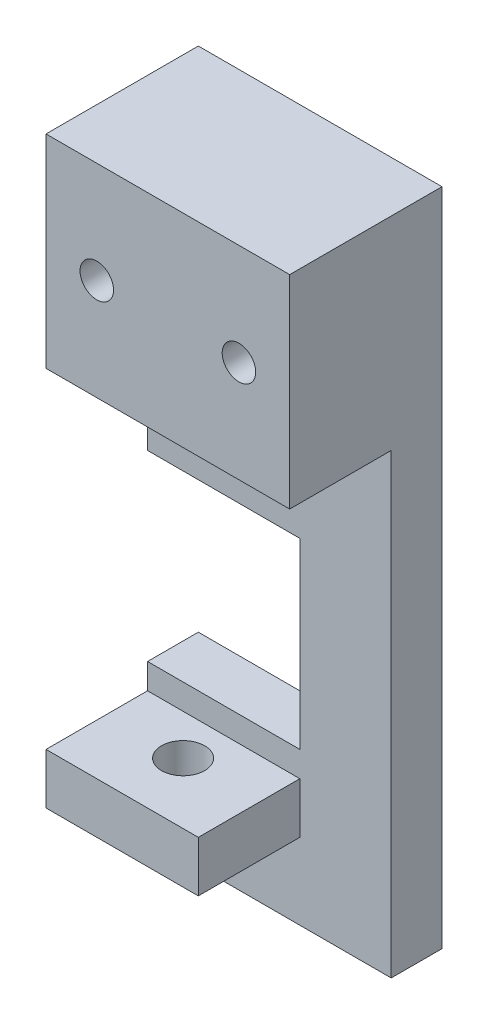
ISO-10303-21;
HEADER;
FILE_DESCRIPTION(('STEP AP214'),'2;1');
FILE_NAME('part.step','',(''),(''),'','','');
FILE_SCHEMA(('AUTOMOTIVE_DESIGN { 1 0 10303 214 1 1 1 1 }'));
ENDSEC;
DATA;
#1=APPLICATION_CONTEXT('core data for automotive mechanical design processes');
#2=APPLICATION_PROTOCOL_DEFINITION('international standard','automotive_design',2000,#1);
#3=PRODUCT_CONTEXT('',#1,'mechanical');
#4=PRODUCT('Part','Part','',(#3));
#5=PRODUCT_RELATED_PRODUCT_CATEGORY('part','',(#4));
#6=PRODUCT_DEFINITION_FORMATION('','',#4);
#7=PRODUCT_DEFINITION_CONTEXT('part definition',#1,'design');
#8=PRODUCT_DEFINITION('design','',#6,#7);
#9=PRODUCT_DEFINITION_SHAPE('','',#8);
#10=(LENGTH_UNIT() NAMED_UNIT(*) SI_UNIT(.MILLI.,.METRE.));
#11=(NAMED_UNIT(*) PLANE_ANGLE_UNIT() SI_UNIT($,.RADIAN.));
#12=(NAMED_UNIT(*) SI_UNIT($,.STERADIAN.) SOLID_ANGLE_UNIT());
#13=UNCERTAINTY_MEASURE_WITH_UNIT(LENGTH_MEASURE(1.E-05),#10,'distance_accuracy_value','');
#14=(GEOMETRIC_REPRESENTATION_CONTEXT(3) GLOBAL_UNCERTAINTY_ASSIGNED_CONTEXT((#13)) GLOBAL_UNIT_ASSIGNED_CONTEXT((#10,
#11,#12)) REPRESENTATION_CONTEXT('',''));
#15=CARTESIAN_POINT('',(0.,0.,0.));
#16=DIRECTION('',(0.,0.,1.));
#17=DIRECTION('',(1.,0.,0.));
#18=AXIS2_PLACEMENT_3D('',#15,#16,#17);
#19=CARTESIAN_POINT('',(15.,15.,18.0023));
#20=DIRECTION('',(0.,1.,0.));
#21=DIRECTION('',(0.,0.,1.));
#22=AXIS2_PLACEMENT_3D('',#19,#20,#21);
#23=CYLINDRICAL_SURFACE('',#22,4.25);
#24=CARTESIAN_POINT('',(15.,15.,18.0023));
#25=DIRECTION('',(0.,1.,0.));
#26=DIRECTION('',(0.,0.,1.));
#27=AXIS2_PLACEMENT_3D('',#24,#25,#26);
#28=CIRCLE('',#27,4.25);
#29=CARTESIAN_POINT('',(15.,15.,22.2523));
#30=VERTEX_POINT('',#29);
#31=EDGE_CURVE('E130',#30,#30,#28,.F.);
#32=ORIENTED_EDGE('',*,*,#31,.T.);
#33=EDGE_LOOP('',(#32));
#34=FACE_BOUND('',#33,.T.);
#35=CARTESIAN_POINT('',(15.,25.,18.0023));
#36=DIRECTION('',(0.,1.,0.));
#37=DIRECTION('',(0.,0.,1.));
#38=AXIS2_PLACEMENT_3D('',#35,#36,#37);
#39=CIRCLE('',#38,4.25);
#40=CARTESIAN_POINT('',(15.,25.,22.2523));
#41=VERTEX_POINT('',#40);
#42=EDGE_CURVE('E19',#41,#41,#39,.F.);
#43=ORIENTED_EDGE('',*,*,#42,.F.);
#44=EDGE_LOOP('',(#43));
#45=FACE_BOUND('',#44,.T.);
#46=ADVANCED_FACE('F16',(#34,#45),#23,.F.);
#47=CARTESIAN_POINT('',(30.,15.,30.0023));
#48=DIRECTION('',(0.,0.,1.));
#49=DIRECTION('',(1.,0.,0.));
#50=AXIS2_PLACEMENT_3D('',#47,#48,#49);
#51=PLANE('',#50);
#52=DIRECTION('',(1.,0.,0.));
#53=VECTOR('',#52,1.);
#54=CARTESIAN_POINT('',(30.,15.,30.0023));
#55=LINE('',#54,#53);
#56=CARTESIAN_POINT('',(0.,15.,30.0023));
#57=VERTEX_POINT('',#56);
#58=CARTESIAN_POINT('',(30.,15.,30.0023));
#59=VERTEX_POINT('',#58);
#60=EDGE_CURVE('E115',#57,#59,#55,.T.);
#61=ORIENTED_EDGE('',*,*,#60,.T.);
#62=DIRECTION('',(0.,1.,0.));
#63=VECTOR('',#62,1.);
#64=CARTESIAN_POINT('',(30.,15.,30.0023));
#65=LINE('',#64,#63);
#66=CARTESIAN_POINT('',(30.,25.,30.0023));
#67=VERTEX_POINT('',#66);
#68=EDGE_CURVE('E135',#59,#67,#65,.T.);
#69=ORIENTED_EDGE('',*,*,#68,.T.);
#70=DIRECTION('',(1.,0.,0.));
#71=VECTOR('',#70,1.);
#72=CARTESIAN_POINT('',(30.,25.,30.0023));
#73=LINE('',#72,#71);
#74=CARTESIAN_POINT('',(0.,25.,30.0023));
#75=VERTEX_POINT('',#74);
#76=EDGE_CURVE('E133',#75,#67,#73,.T.);
#77=ORIENTED_EDGE('',*,*,#76,.F.);
#78=DIRECTION('',(0.,1.,0.));
#79=VECTOR('',#78,1.);
#80=CARTESIAN_POINT('',(0.,15.,30.0023));
#81=LINE('',#80,#79);
#82=EDGE_CURVE('E120',#57,#75,#81,.T.);
#83=ORIENTED_EDGE('',*,*,#82,.F.);
#84=EDGE_LOOP('',(#61,#69,#77,#83));
#85=FACE_BOUND('',#84,.T.);
#86=ADVANCED_FACE('F134',(#85),#51,.T.);
#87=CARTESIAN_POINT('',(30.,25.,10.0023));
#88=DIRECTION('',(0.,1.,0.));
#89=DIRECTION('',(0.,0.,1.));
#90=AXIS2_PLACEMENT_3D('',#87,#88,#89);
#91=PLANE('',#90);
#92=ORIENTED_EDGE('',*,*,#42,.T.);
#93=EDGE_LOOP('',(#92));
#94=FACE_BOUND('',#93,.T.);
#95=DIRECTION('',(0.,0.,1.));
#96=VECTOR('',#95,1.);
#97=CARTESIAN_POINT('',(30.,25.,10.0023));
#98=LINE('',#97,#96);
#99=CARTESIAN_POINT('',(30.,25.,10.0023));
#100=VERTEX_POINT('',#99);
#101=EDGE_CURVE('E192',#67,#100,#98,.F.);
#102=ORIENTED_EDGE('',*,*,#101,.T.);
#103=DIRECTION('',(1.,0.,0.));
#104=VECTOR('',#103,1.);
#105=CARTESIAN_POINT('',(30.,25.,10.0023));
#106=LINE('',#105,#104);
#107=CARTESIAN_POINT('',(0.,25.,10.0023));
#108=VERTEX_POINT('',#107);
#109=EDGE_CURVE('E141',#108,#100,#106,.T.);
#110=ORIENTED_EDGE('',*,*,#109,.F.);
#111=DIRECTION('',(0.,0.,1.));
#112=VECTOR('',#111,1.);
#113=CARTESIAN_POINT('',(0.,25.,10.0023));
#114=LINE('',#113,#112);
#115=EDGE_CURVE('E125',#75,#108,#114,.F.);
#116=ORIENTED_EDGE('',*,*,#115,.F.);
#117=ORIENTED_EDGE('',*,*,#76,.T.);
#118=EDGE_LOOP('',(#102,#110,#116,#117));
#119=FACE_BOUND('',#118,.T.);
#120=ADVANCED_FACE('F140',(#94,#119),#91,.T.);
#121=CARTESIAN_POINT('',(30.,15.,10.0023));
#122=DIRECTION('',(0.,1.,0.));
#123=DIRECTION('',(0.,0.,1.));
#124=AXIS2_PLACEMENT_3D('',#121,#122,#123);
#125=PLANE('',#124);
#126=ORIENTED_EDGE('',*,*,#31,.F.);
#127=EDGE_LOOP('',(#126));
#128=FACE_BOUND('',#127,.T.);
#129=DIRECTION('',(0.,0.,1.));
#130=VECTOR('',#129,1.);
#131=CARTESIAN_POINT('',(30.,15.,10.0023));
#132=LINE('',#131,#130);
#133=CARTESIAN_POINT('',(30.,15.,10.0023));
#134=VERTEX_POINT('',#133);
#135=EDGE_CURVE('E187',#134,#59,#132,.T.);
#136=ORIENTED_EDGE('',*,*,#135,.T.);
#137=ORIENTED_EDGE('',*,*,#60,.F.);
#138=DIRECTION('',(0.,0.,1.));
#139=VECTOR('',#138,1.);
#140=CARTESIAN_POINT('',(0.,15.,10.0023));
#141=LINE('',#140,#139);
#142=CARTESIAN_POINT('',(0.,15.,10.0023));
#143=VERTEX_POINT('',#142);
#144=EDGE_CURVE('E128',#143,#57,#141,.T.);
#145=ORIENTED_EDGE('',*,*,#144,.F.);
#146=DIRECTION('',(1.,0.,0.));
#147=VECTOR('',#146,1.);
#148=CARTESIAN_POINT('',(30.,15.,10.0023));
#149=LINE('',#148,#147);
#150=EDGE_CURVE('E188',#134,#143,#149,.F.);
#151=ORIENTED_EDGE('',*,*,#150,.F.);
#152=EDGE_LOOP('',(#136,#137,#145,#151));
#153=FACE_BOUND('',#152,.T.);
#154=ADVANCED_FACE('F182',(#128,#153),#125,.F.);
#155=CARTESIAN_POINT('',(40.,52.,5.0023));
#156=DIRECTION('',(1.,0.,0.));
#157=DIRECTION('',(0.,0.,-1.));
#158=AXIS2_PLACEMENT_3D('',#155,#156,#157);
#159=PLANE('',#158);
#160=CARTESIAN_POINT('',(40.,52.,5.0023));
#161=DIRECTION('',(1.,0.,0.));
#162=DIRECTION('',(0.,0.,-1.));
#163=AXIS2_PLACEMENT_3D('',#160,#161,#162);
#164=CIRCLE('',#163,1.5);
#165=CARTESIAN_POINT('',(40.,52.,3.5023));
#166=VERTEX_POINT('',#165);
#167=EDGE_CURVE('E174',#166,#166,#164,.F.);
#168=ORIENTED_EDGE('',*,*,#167,.T.);
#169=EDGE_LOOP('',(#168));
#170=FACE_BOUND('',#169,.T.);
#171=ADVANCED_FACE('F184',(#170),#159,.F.);
#172=CARTESIAN_POINT('',(40.,44.,5.0023));
#173=DIRECTION('',(1.,0.,0.));
#174=DIRECTION('',(0.,0.,-1.));
#175=AXIS2_PLACEMENT_3D('',#172,#173,#174);
#176=PLANE('',#175);
#177=CARTESIAN_POINT('',(40.,44.,5.0023));
#178=DIRECTION('',(1.,0.,0.));
#179=DIRECTION('',(0.,0.,-1.));
#180=AXIS2_PLACEMENT_3D('',#177,#178,#179);
#181=CIRCLE('',#180,1.5);
#182=CARTESIAN_POINT('',(40.,44.,3.5023));
#183=VERTEX_POINT('',#182);
#184=EDGE_CURVE('E170',#183,#183,#181,.F.);
#185=ORIENTED_EDGE('',*,*,#184,.T.);
#186=EDGE_LOOP('',(#185));
#187=FACE_BOUND('',#186,.T.);
#188=ADVANCED_FACE('F360',(#187),#176,.F.);
#189=CARTESIAN_POINT('',(30.,15.,10.0023));
#190=DIRECTION('',(-1.,0.,0.));
#191=DIRECTION('',(0.,0.,1.));
#192=AXIS2_PLACEMENT_3D('',#189,#190,#191);
#193=PLANE('',#192);
#194=DIRECTION('',(0.,1.,0.));
#195=VECTOR('',#194,1.);
#196=CARTESIAN_POINT('',(30.,0.,10.0023));
#197=LINE('',#196,#195);
#198=EDGE_CURVE('E202',#100,#134,#197,.F.);
#199=ORIENTED_EDGE('',*,*,#198,.F.);
#200=ORIENTED_EDGE('',*,*,#101,.F.);
#201=ORIENTED_EDGE('',*,*,#68,.F.);
#202=ORIENTED_EDGE('',*,*,#135,.F.);
#203=EDGE_LOOP('',(#199,#200,#201,#202));
#204=FACE_BOUND('',#203,.T.);
#205=ADVANCED_FACE('F205',(#204),#193,.F.);
#206=CARTESIAN_POINT('',(48.,90.,10.0023));
#207=DIRECTION('',(0.,1.,0.));
#208=DIRECTION('',(0.,0.,1.));
#209=AXIS2_PLACEMENT_3D('',#206,#207,#208);
#210=PLANE('',#209);
#211=DIRECTION('',(0.,0.,1.));
#212=VECTOR('',#211,1.);
#213=CARTESIAN_POINT('',(48.,90.,10.0023));
#214=LINE('',#213,#212);
#215=CARTESIAN_POINT('',(48.,90.,10.0023));
#216=VERTEX_POINT('',#215);
#217=CARTESIAN_POINT('',(48.,90.,30.0023));
#218=VERTEX_POINT('',#217);
#219=EDGE_CURVE('E206',#216,#218,#214,.T.);
#220=ORIENTED_EDGE('',*,*,#219,.T.);
#221=DIRECTION('',(1.,0.,0.));
#222=VECTOR('',#221,1.);
#223=CARTESIAN_POINT('',(48.,90.,30.0023));
#224=LINE('',#223,#222);
#225=CARTESIAN_POINT('',(0.,90.,30.0023));
#226=VERTEX_POINT('',#225);
#227=EDGE_CURVE('E243',#226,#218,#224,.T.);
#228=ORIENTED_EDGE('',*,*,#227,.F.);
#229=DIRECTION('',(0.,0.,1.));
#230=VECTOR('',#229,1.);
#231=CARTESIAN_POINT('',(0.,90.,10.0023));
#232=LINE('',#231,#230);
#233=CARTESIAN_POINT('',(0.,90.,10.0023));
#234=VERTEX_POINT('',#233);
#235=EDGE_CURVE('E194',#234,#226,#232,.T.);
#236=ORIENTED_EDGE('',*,*,#235,.F.);
#237=DIRECTION('',(1.,0.,0.));
#238=VECTOR('',#237,1.);
#239=CARTESIAN_POINT('',(48.,90.,10.0023));
#240=LINE('',#239,#238);
#241=EDGE_CURVE('E207',#216,#234,#240,.F.);
#242=ORIENTED_EDGE('',*,*,#241,.F.);
#243=EDGE_LOOP('',(#220,#228,#236,#242));
#244=FACE_BOUND('',#243,.T.);
#245=ADVANCED_FACE('F244',(#244),#210,.F.);
#246=CARTESIAN_POINT('',(0.,66.,0.002299999999991));
#247=DIRECTION('',(-1.,0.,0.));
#248=DIRECTION('',(0.,0.,1.));
#249=AXIS2_PLACEMENT_3D('',#246,#247,#248);
#250=PLANE('',#249);
#251=DIRECTION('',(0.,1.,0.));
#252=VECTOR('',#251,1.);
#253=CARTESIAN_POINT('',(0.,66.,0.002299999999991));
#254=LINE('',#253,#252);
#255=CARTESIAN_POINT('',(0.,130.,0.002299999999991));
#256=VERTEX_POINT('',#255);
#257=CARTESIAN_POINT('',(0.,66.,0.002299999999991));
#258=VERTEX_POINT('',#257);
#259=EDGE_CURVE('E168',#256,#258,#254,.F.);
#260=ORIENTED_EDGE('',*,*,#259,.T.);
#261=DIRECTION('',(0.,0.,1.));
#262=VECTOR('',#261,1.);
#263=CARTESIAN_POINT('',(0.,66.,0.002299999999991));
#264=LINE('',#263,#262);
#265=CARTESIAN_POINT('',(0.,66.,10.0023));
#266=VERTEX_POINT('',#265);
#267=EDGE_CURVE('E225',#258,#266,#264,.T.);
#268=ORIENTED_EDGE('',*,*,#267,.T.);
#269=DIRECTION('',(0.,1.,0.));
#270=VECTOR('',#269,1.);
#271=CARTESIAN_POINT('',(0.,66.,10.0023));
#272=LINE('',#271,#270);
#273=EDGE_CURVE('E231',#266,#234,#272,.T.);
#274=ORIENTED_EDGE('',*,*,#273,.T.);
#275=ORIENTED_EDGE('',*,*,#235,.T.);
#276=DIRECTION('',(0.,1.,0.));
#277=VECTOR('',#276,1.);
#278=CARTESIAN_POINT('',(0.,90.,30.0023));
#279=LINE('',#278,#277);
#280=CARTESIAN_POINT('',(0.,130.,30.0023));
#281=VERTEX_POINT('',#280);
#282=EDGE_CURVE('E240',#281,#226,#279,.F.);
#283=ORIENTED_EDGE('',*,*,#282,.F.);
#284=DIRECTION('',(0.,0.,1.));
#285=VECTOR('',#284,1.);
#286=CARTESIAN_POINT('',(0.,130.,0.002299999999991));
#287=LINE('',#286,#285);
#288=EDGE_CURVE('E228',#281,#256,#287,.F.);
#289=ORIENTED_EDGE('',*,*,#288,.T.);
#290=EDGE_LOOP('',(#260,#268,#274,#275,#283,#289));
#291=FACE_BOUND('',#290,.T.);
#292=ADVANCED_FACE('F239',(#291),#250,.T.);
#293=CARTESIAN_POINT('',(10.,110.,0.002299999999991));
#294=DIRECTION('',(0.,0.,1.));
#295=DIRECTION('',(1.,0.,0.));
#296=AXIS2_PLACEMENT_3D('',#293,#294,#295);
#297=CYLINDRICAL_SURFACE('',#296,3.3);
#298=CARTESIAN_POINT('',(10.,110.,0.002299999999991));
#299=DIRECTION('',(0.,0.,1.));
#300=DIRECTION('',(1.,0.,0.));
#301=AXIS2_PLACEMENT_3D('',#298,#299,#300);
#302=CIRCLE('',#301,3.3);
#303=CARTESIAN_POINT('',(13.3,110.,0.002299999999991));
#304=VERTEX_POINT('',#303);
#305=EDGE_CURVE('E160',#304,#304,#302,.F.);
#306=ORIENTED_EDGE('',*,*,#305,.T.);
#307=EDGE_LOOP('',(#306));
#308=FACE_BOUND('',#307,.T.);
#309=CARTESIAN_POINT('',(10.,110.,30.0023));
#310=DIRECTION('',(0.,0.,1.));
#311=DIRECTION('',(1.,0.,0.));
#312=AXIS2_PLACEMENT_3D('',#309,#310,#311);
#313=CIRCLE('',#312,3.3);
#314=CARTESIAN_POINT('',(13.3,110.,30.0023));
#315=VERTEX_POINT('',#314);
#316=EDGE_CURVE('E165',#315,#315,#313,.F.);
#317=ORIENTED_EDGE('',*,*,#316,.F.);
#318=EDGE_LOOP('',(#317));
#319=FACE_BOUND('',#318,.T.);
#320=ADVANCED_FACE('F311',(#308,#319),#297,.F.);
#321=CARTESIAN_POINT('',(30.,66.,0.002299999999991));
#322=DIRECTION('',(0.,1.,0.));
#323=DIRECTION('',(0.,0.,1.));
#324=AXIS2_PLACEMENT_3D('',#321,#322,#323);
#325=PLANE('',#324);
#326=DIRECTION('',(0.,0.,1.));
#327=VECTOR('',#326,1.);
#328=CARTESIAN_POINT('',(30.,66.,0.002299999999991));
#329=LINE('',#328,#327);
#330=CARTESIAN_POINT('',(30.,66.,10.0023));
#331=VERTEX_POINT('',#330);
#332=CARTESIAN_POINT('',(30.,66.,0.002299999999991));
#333=VERTEX_POINT('',#332);
#334=EDGE_CURVE('E163',#331,#333,#329,.F.);
#335=ORIENTED_EDGE('',*,*,#334,.F.);
#336=DIRECTION('',(1.,0.,0.));
#337=VECTOR('',#336,1.);
#338=CARTESIAN_POINT('',(30.,66.,10.0023));
#339=LINE('',#338,#337);
#340=EDGE_CURVE('E176',#266,#331,#339,.T.);
#341=ORIENTED_EDGE('',*,*,#340,.F.);
#342=ORIENTED_EDGE('',*,*,#267,.F.);
#343=DIRECTION('',(1.,0.,0.));
#344=VECTOR('',#343,1.);
#345=CARTESIAN_POINT('',(30.,66.,0.002299999999991));
#346=LINE('',#345,#344);
#347=EDGE_CURVE('E164',#258,#333,#346,.T.);
#348=ORIENTED_EDGE('',*,*,#347,.T.);
#349=EDGE_LOOP('',(#335,#341,#342,#348));
#350=FACE_BOUND('',#349,.T.);
#351=ADVANCED_FACE('F308',(#350),#325,.F.);
#352=CARTESIAN_POINT('',(30.,52.,5.0023));
#353=DIRECTION('',(1.,0.,0.));
#354=DIRECTION('',(0.,0.,-1.));
#355=AXIS2_PLACEMENT_3D('',#352,#353,#354);
#356=CYLINDRICAL_SURFACE('',#355,1.5);
#357=CARTESIAN_POINT('',(30.,52.,5.0023));
#358=DIRECTION('',(1.,0.,0.));
#359=DIRECTION('',(0.,0.,-1.));
#360=AXIS2_PLACEMENT_3D('',#357,#358,#359);
#361=CIRCLE('',#360,1.5);
#362=CARTESIAN_POINT('',(30.,52.,3.5023));
#363=VERTEX_POINT('',#362);
#364=EDGE_CURVE('E156',#363,#363,#361,.T.);
#365=ORIENTED_EDGE('',*,*,#364,.F.);
#366=EDGE_LOOP('',(#365));
#367=FACE_BOUND('',#366,.T.);
#368=ORIENTED_EDGE('',*,*,#167,.F.);
#369=EDGE_LOOP('',(#368));
#370=FACE_BOUND('',#369,.T.);
#371=ADVANCED_FACE('F310',(#367,#370),#356,.F.);
#372=CARTESIAN_POINT('',(30.,44.,5.0023));
#373=DIRECTION('',(1.,0.,0.));
#374=DIRECTION('',(0.,0.,-1.));
#375=AXIS2_PLACEMENT_3D('',#372,#373,#374);
#376=CYLINDRICAL_SURFACE('',#375,1.5);
#377=CARTESIAN_POINT('',(30.,44.,5.0023));
#378=DIRECTION('',(1.,0.,0.));
#379=DIRECTION('',(0.,0.,-1.));
#380=AXIS2_PLACEMENT_3D('',#377,#378,#379);
#381=CIRCLE('',#380,1.5);
#382=CARTESIAN_POINT('',(30.,44.,3.5023));
#383=VERTEX_POINT('',#382);
#384=EDGE_CURVE('E152',#383,#383,#381,.T.);
#385=ORIENTED_EDGE('',*,*,#384,.F.);
#386=EDGE_LOOP('',(#385));
#387=FACE_BOUND('',#386,.T.);
#388=ORIENTED_EDGE('',*,*,#184,.F.);
#389=EDGE_LOOP('',(#388));
#390=FACE_BOUND('',#389,.T.);
#391=ADVANCED_FACE('F318',(#387,#390),#376,.F.);
#392=CARTESIAN_POINT('',(30.,30.,0.002299999999991));
#393=DIRECTION('',(0.,1.,0.));
#394=DIRECTION('',(0.,0.,1.));
#395=AXIS2_PLACEMENT_3D('',#392,#393,#394);
#396=PLANE('',#395);
#397=DIRECTION('',(0.,0.,1.));
#398=VECTOR('',#397,1.);
#399=CARTESIAN_POINT('',(30.,30.,0.002299999999991));
#400=LINE('',#399,#398);
#401=CARTESIAN_POINT('',(30.,30.,0.002299999999991));
#402=VERTEX_POINT('',#401);
#403=CARTESIAN_POINT('',(30.,30.,10.0023));
#404=VERTEX_POINT('',#403);
#405=EDGE_CURVE('E269',#402,#404,#400,.T.);
#406=ORIENTED_EDGE('',*,*,#405,.F.);
#407=DIRECTION('',(1.,0.,0.));
#408=VECTOR('',#407,1.);
#409=CARTESIAN_POINT('',(30.,30.,0.002299999999991));
#410=LINE('',#409,#408);
#411=CARTESIAN_POINT('',(0.,30.,0.002299999999991));
#412=VERTEX_POINT('',#411);
#413=EDGE_CURVE('E155',#402,#412,#410,.F.);
#414=ORIENTED_EDGE('',*,*,#413,.T.);
#415=DIRECTION('',(0.,0.,1.));
#416=VECTOR('',#415,1.);
#417=CARTESIAN_POINT('',(0.,30.,0.002299999999991));
#418=LINE('',#417,#416);
#419=CARTESIAN_POINT('',(0.,30.,10.0023));
#420=VERTEX_POINT('',#419);
#421=EDGE_CURVE('E218',#420,#412,#418,.F.);
#422=ORIENTED_EDGE('',*,*,#421,.F.);
#423=DIRECTION('',(1.,0.,0.));
#424=VECTOR('',#423,1.);
#425=CARTESIAN_POINT('',(30.,30.,10.0023));
#426=LINE('',#425,#424);
#427=EDGE_CURVE('E173',#420,#404,#426,.T.);
#428=ORIENTED_EDGE('',*,*,#427,.T.);
#429=EDGE_LOOP('',(#406,#414,#422,#428));
#430=FACE_BOUND('',#429,.T.);
#431=ADVANCED_FACE('F301',(#430),#396,.T.);
#432=CARTESIAN_POINT('',(0.,0.,0.002299999999991));
#433=DIRECTION('',(-1.,0.,0.));
#434=DIRECTION('',(0.,0.,1.));
#435=AXIS2_PLACEMENT_3D('',#432,#433,#434);
#436=PLANE('',#435);
#437=DIRECTION('',(0.,1.,0.));
#438=VECTOR('',#437,1.);
#439=CARTESIAN_POINT('',(0.,0.,0.002299999999991));
#440=LINE('',#439,#438);
#441=CARTESIAN_POINT('',(0.,0.,0.002299999999991));
#442=VERTEX_POINT('',#441);
#443=EDGE_CURVE('E276',#412,#442,#440,.F.);
#444=ORIENTED_EDGE('',*,*,#443,.T.);
#445=DIRECTION('',(0.,0.,1.));
#446=VECTOR('',#445,1.);
#447=CARTESIAN_POINT('',(0.,0.,0.002299999999991));
#448=LINE('',#447,#446);
#449=CARTESIAN_POINT('',(0.,0.,10.0023));
#450=VERTEX_POINT('',#449);
#451=EDGE_CURVE('E212',#442,#450,#448,.T.);
#452=ORIENTED_EDGE('',*,*,#451,.T.);
#453=DIRECTION('',(0.,1.,0.));
#454=VECTOR('',#453,1.);
#455=CARTESIAN_POINT('',(0.,0.,10.0023));
#456=LINE('',#455,#454);
#457=EDGE_CURVE('E221',#450,#143,#456,.T.);
#458=ORIENTED_EDGE('',*,*,#457,.T.);
#459=ORIENTED_EDGE('',*,*,#144,.T.);
#460=ORIENTED_EDGE('',*,*,#82,.T.);
#461=ORIENTED_EDGE('',*,*,#115,.T.);
#462=DIRECTION('',(0.,1.,0.));
#463=VECTOR('',#462,1.);
#464=CARTESIAN_POINT('',(0.,0.,10.0023));
#465=LINE('',#464,#463);
#466=EDGE_CURVE('E204',#108,#420,#465,.T.);
#467=ORIENTED_EDGE('',*,*,#466,.T.);
#468=ORIENTED_EDGE('',*,*,#421,.T.);
#469=EDGE_LOOP('',(#444,#452,#458,#459,#460,#461,#467,#468));
#470=FACE_BOUND('',#469,.T.);
#471=ADVANCED_FACE('F123',(#470),#436,.T.);
#472=CARTESIAN_POINT('',(48.,0.,10.0023));
#473=DIRECTION('',(0.,0.,1.));
#474=DIRECTION('',(1.,0.,0.));
#475=AXIS2_PLACEMENT_3D('',#472,#473,#474);
#476=PLANE('',#475);
#477=DIRECTION('',(1.,0.,0.));
#478=VECTOR('',#477,1.);
#479=CARTESIAN_POINT('',(48.,0.,10.0023));
#480=LINE('',#479,#478);
#481=CARTESIAN_POINT('',(48.,0.,10.0023));
#482=VERTEX_POINT('',#481);
#483=EDGE_CURVE('E278',#450,#482,#480,.T.);
#484=ORIENTED_EDGE('',*,*,#483,.T.);
#485=DIRECTION('',(0.,1.,0.));
#486=VECTOR('',#485,1.);
#487=CARTESIAN_POINT('',(48.,0.,10.0023));
#488=LINE('',#487,#486);
#489=EDGE_CURVE('E280',#482,#216,#488,.T.);
#490=ORIENTED_EDGE('',*,*,#489,.T.);
#491=ORIENTED_EDGE('',*,*,#241,.T.);
#492=ORIENTED_EDGE('',*,*,#273,.F.);
#493=ORIENTED_EDGE('',*,*,#340,.T.);
#494=DIRECTION('',(0.,1.,0.));
#495=VECTOR('',#494,1.);
#496=CARTESIAN_POINT('',(30.,0.,10.0023));
#497=LINE('',#496,#495);
#498=EDGE_CURVE('E159',#404,#331,#497,.T.);
#499=ORIENTED_EDGE('',*,*,#498,.F.);
#500=ORIENTED_EDGE('',*,*,#427,.F.);
#501=ORIENTED_EDGE('',*,*,#466,.F.);
#502=ORIENTED_EDGE('',*,*,#109,.T.);
#503=ORIENTED_EDGE('',*,*,#198,.T.);
#504=ORIENTED_EDGE('',*,*,#150,.T.);
#505=ORIENTED_EDGE('',*,*,#457,.F.);
#506=EDGE_LOOP('',(#484,#490,#491,#492,#493,#499,#500,#501,#502,#503,#504,#505));
#507=FACE_BOUND('',#506,.T.);
#508=ADVANCED_FACE('F201',(#507),#476,.T.);
#509=CARTESIAN_POINT('',(48.,90.,30.0023));
#510=DIRECTION('',(0.,0.,1.));
#511=DIRECTION('',(1.,0.,0.));
#512=AXIS2_PLACEMENT_3D('',#509,#510,#511);
#513=PLANE('',#512);
#514=ORIENTED_EDGE('',*,*,#316,.T.);
#515=EDGE_LOOP('',(#514));
#516=FACE_BOUND('',#515,.T.);
#517=CARTESIAN_POINT('',(38.,110.,30.0023));
#518=DIRECTION('',(0.,0.,1.));
#519=DIRECTION('',(1.,0.,0.));
#520=AXIS2_PLACEMENT_3D('',#517,#518,#519);
#521=CIRCLE('',#520,3.3);
#522=CARTESIAN_POINT('',(41.3,110.,30.0023));
#523=VERTEX_POINT('',#522);
#524=EDGE_CURVE('E148',#523,#523,#521,.F.);
#525=ORIENTED_EDGE('',*,*,#524,.T.);
#526=EDGE_LOOP('',(#525));
#527=FACE_BOUND('',#526,.T.);
#528=ORIENTED_EDGE('',*,*,#227,.T.);
#529=DIRECTION('',(0.,1.,0.));
#530=VECTOR('',#529,1.);
#531=CARTESIAN_POINT('',(48.,90.,30.0023));
#532=LINE('',#531,#530);
#533=CARTESIAN_POINT('',(48.,130.,30.0023));
#534=VERTEX_POINT('',#533);
#535=EDGE_CURVE('E169',#218,#534,#532,.T.);
#536=ORIENTED_EDGE('',*,*,#535,.T.);
#537=DIRECTION('',(1.,0.,0.));
#538=VECTOR('',#537,1.);
#539=CARTESIAN_POINT('',(48.,130.,30.0023));
#540=LINE('',#539,#538);
#541=EDGE_CURVE('E210',#534,#281,#540,.F.);
#542=ORIENTED_EDGE('',*,*,#541,.T.);
#543=ORIENTED_EDGE('',*,*,#282,.T.);
#544=EDGE_LOOP('',(#528,#536,#542,#543));
#545=FACE_BOUND('',#544,.T.);
#546=ADVANCED_FACE('F254',(#516,#527,#545),#513,.T.);
#547=CARTESIAN_POINT('',(48.,130.,0.002299999999991));
#548=DIRECTION('',(0.,1.,0.));
#549=DIRECTION('',(0.,0.,1.));
#550=AXIS2_PLACEMENT_3D('',#547,#548,#549);
#551=PLANE('',#550);
#552=DIRECTION('',(0.,0.,1.));
#553=VECTOR('',#552,1.);
#554=CARTESIAN_POINT('',(48.,130.,0.002299999999991));
#555=LINE('',#554,#553);
#556=CARTESIAN_POINT('',(48.,130.,0.002299999999991));
#557=VERTEX_POINT('',#556);
#558=EDGE_CURVE('E258',#534,#557,#555,.F.);
#559=ORIENTED_EDGE('',*,*,#558,.T.);
#560=DIRECTION('',(1.,0.,0.));
#561=VECTOR('',#560,1.);
#562=CARTESIAN_POINT('',(48.,130.,0.002299999999991));
#563=LINE('',#562,#561);
#564=EDGE_CURVE('E151',#557,#256,#563,.F.);
#565=ORIENTED_EDGE('',*,*,#564,.T.);
#566=ORIENTED_EDGE('',*,*,#288,.F.);
#567=ORIENTED_EDGE('',*,*,#541,.F.);
#568=EDGE_LOOP('',(#559,#565,#566,#567));
#569=FACE_BOUND('',#568,.T.);
#570=ADVANCED_FACE('F257',(#569),#551,.T.);
#571=CARTESIAN_POINT('',(30.,0.,0.002299999999991));
#572=DIRECTION('',(-1.,0.,0.));
#573=DIRECTION('',(0.,0.,1.));
#574=AXIS2_PLACEMENT_3D('',#571,#572,#573);
#575=PLANE('',#574);
#576=ORIENTED_EDGE('',*,*,#384,.T.);
#577=EDGE_LOOP('',(#576));
#578=FACE_BOUND('',#577,.T.);
#579=ORIENTED_EDGE('',*,*,#364,.T.);
#580=EDGE_LOOP('',(#579));
#581=FACE_BOUND('',#580,.T.);
#582=ORIENTED_EDGE('',*,*,#405,.T.);
#583=ORIENTED_EDGE('',*,*,#498,.T.);
#584=ORIENTED_EDGE('',*,*,#334,.T.);
#585=DIRECTION('',(0.,1.,0.));
#586=VECTOR('',#585,1.);
#587=CARTESIAN_POINT('',(30.,0.,0.002299999999991));
#588=LINE('',#587,#586);
#589=EDGE_CURVE('E286',#333,#402,#588,.F.);
#590=ORIENTED_EDGE('',*,*,#589,.T.);
#591=EDGE_LOOP('',(#582,#583,#584,#590));
#592=FACE_BOUND('',#591,.T.);
#593=ADVANCED_FACE('F304',(#578,#581,#592),#575,.T.);
#594=CARTESIAN_POINT('',(48.,0.,0.002299999999991));
#595=DIRECTION('',(0.,1.,0.));
#596=DIRECTION('',(0.,0.,1.));
#597=AXIS2_PLACEMENT_3D('',#594,#595,#596);
#598=PLANE('',#597);
#599=DIRECTION('',(0.,0.,1.));
#600=VECTOR('',#599,1.);
#601=CARTESIAN_POINT('',(48.,0.,0.002299999999991));
#602=LINE('',#601,#600);
#603=CARTESIAN_POINT('',(48.,0.,0.002299999999991));
#604=VERTEX_POINT('',#603);
#605=EDGE_CURVE('E34',#604,#482,#602,.T.);
#606=ORIENTED_EDGE('',*,*,#605,.T.);
#607=ORIENTED_EDGE('',*,*,#483,.F.);
#608=ORIENTED_EDGE('',*,*,#451,.F.);
#609=DIRECTION('',(1.,0.,0.));
#610=VECTOR('',#609,1.);
#611=CARTESIAN_POINT('',(48.,0.,0.002299999999991));
#612=LINE('',#611,#610);
#613=EDGE_CURVE('E289',#442,#604,#612,.T.);
#614=ORIENTED_EDGE('',*,*,#613,.T.);
#615=EDGE_LOOP('',(#606,#607,#608,#614));
#616=FACE_BOUND('',#615,.T.);
#617=ADVANCED_FACE('F296',(#616),#598,.F.);
#618=CARTESIAN_POINT('',(48.,0.,0.002299999999991));
#619=DIRECTION('',(-1.,0.,0.));
#620=DIRECTION('',(0.,0.,1.));
#621=AXIS2_PLACEMENT_3D('',#618,#619,#620);
#622=PLANE('',#621);
#623=DIRECTION('',(0.,1.,0.));
#624=VECTOR('',#623,1.);
#625=CARTESIAN_POINT('',(48.,0.,0.002299999999991));
#626=LINE('',#625,#624);
#627=EDGE_CURVE('E25',#604,#557,#626,.T.);
#628=ORIENTED_EDGE('',*,*,#627,.T.);
#629=ORIENTED_EDGE('',*,*,#558,.F.);
#630=ORIENTED_EDGE('',*,*,#535,.F.);
#631=ORIENTED_EDGE('',*,*,#219,.F.);
#632=ORIENTED_EDGE('',*,*,#489,.F.);
#633=ORIENTED_EDGE('',*,*,#605,.F.);
#634=EDGE_LOOP('',(#628,#629,#630,#631,#632,#633));
#635=FACE_BOUND('',#634,.T.);
#636=ADVANCED_FACE('F292',(#635),#622,.F.);
#637=CARTESIAN_POINT('',(38.,110.,0.002299999999991));
#638=DIRECTION('',(0.,0.,1.));
#639=DIRECTION('',(1.,0.,0.));
#640=AXIS2_PLACEMENT_3D('',#637,#638,#639);
#641=CYLINDRICAL_SURFACE('',#640,3.3);
#642=CARTESIAN_POINT('',(38.,110.,0.002299999999991));
#643=DIRECTION('',(0.,0.,1.));
#644=DIRECTION('',(1.,0.,0.));
#645=AXIS2_PLACEMENT_3D('',#642,#643,#644);
#646=CIRCLE('',#645,3.3);
#647=CARTESIAN_POINT('',(41.3,110.,0.002299999999991));
#648=VERTEX_POINT('',#647);
#649=EDGE_CURVE('E11',#648,#648,#646,.F.);
#650=ORIENTED_EDGE('',*,*,#649,.T.);
#651=EDGE_LOOP('',(#650));
#652=FACE_BOUND('',#651,.T.);
#653=ORIENTED_EDGE('',*,*,#524,.F.);
#654=EDGE_LOOP('',(#653));
#655=FACE_BOUND('',#654,.T.);
#656=ADVANCED_FACE('F324',(#652,#655),#641,.F.);
#657=CARTESIAN_POINT('',(48.,0.,0.002299999999991));
#658=DIRECTION('',(0.,0.,1.));
#659=DIRECTION('',(1.,0.,0.));
#660=AXIS2_PLACEMENT_3D('',#657,#658,#659);
#661=PLANE('',#660);
#662=ORIENTED_EDGE('',*,*,#649,.F.);
#663=EDGE_LOOP('',(#662));
#664=FACE_BOUND('',#663,.T.);
#665=ORIENTED_EDGE('',*,*,#613,.F.);
#666=ORIENTED_EDGE('',*,*,#443,.F.);
#667=ORIENTED_EDGE('',*,*,#413,.F.);
#668=ORIENTED_EDGE('',*,*,#589,.F.);
#669=ORIENTED_EDGE('',*,*,#347,.F.);
#670=ORIENTED_EDGE('',*,*,#259,.F.);
#671=ORIENTED_EDGE('',*,*,#564,.F.);
#672=ORIENTED_EDGE('',*,*,#627,.F.);
#673=EDGE_LOOP('',(#665,#666,#667,#668,#669,#670,#671,#672));
#674=FACE_BOUND('',#673,.T.);
#675=ORIENTED_EDGE('',*,*,#305,.F.);
#676=EDGE_LOOP('',(#675));
#677=FACE_BOUND('',#676,.T.);
#678=ADVANCED_FACE('F262',(#664,#674,#677),#661,.F.);
#679=CLOSED_SHELL('',(#46,#86,#120,#154,#171,#188,#205,#245,#292,#320,#351,#371,#391,#431,#471,
#508,#546,#570,#593,#617,#636,#656,#678));
#680=MANIFOLD_SOLID_BREP('B1',#679);
#681=ADVANCED_BREP_SHAPE_REPRESENTATION('',(#18,#680),#14);
#682=SHAPE_DEFINITION_REPRESENTATION(#9,#681);
ENDSEC;
END-ISO-10303-21;
